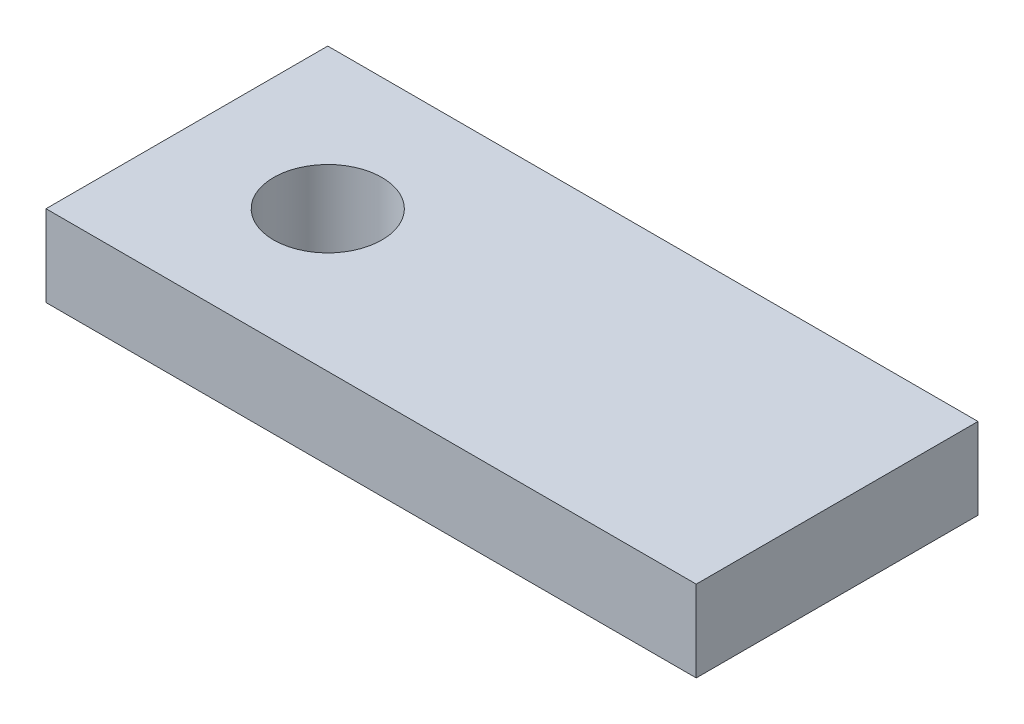
ISO-10303-21;
HEADER;
FILE_DESCRIPTION(('STEP AP214'),'2;1');
FILE_NAME('part.step','',(''),(''),'','','');
FILE_SCHEMA(('AUTOMOTIVE_DESIGN { 1 0 10303 214 1 1 1 1 }'));
ENDSEC;
DATA;
#1=APPLICATION_CONTEXT('core data for automotive mechanical design processes');
#2=APPLICATION_PROTOCOL_DEFINITION('international standard','automotive_design',2000,#1);
#3=PRODUCT_CONTEXT('',#1,'mechanical');
#4=PRODUCT('Part','Part','',(#3));
#5=PRODUCT_RELATED_PRODUCT_CATEGORY('part','',(#4));
#6=PRODUCT_DEFINITION_FORMATION('','',#4);
#7=PRODUCT_DEFINITION_CONTEXT('part definition',#1,'design');
#8=PRODUCT_DEFINITION('design','',#6,#7);
#9=PRODUCT_DEFINITION_SHAPE('','',#8);
#10=(LENGTH_UNIT() NAMED_UNIT(*) SI_UNIT(.MILLI.,.METRE.));
#11=(NAMED_UNIT(*) PLANE_ANGLE_UNIT() SI_UNIT($,.RADIAN.));
#12=(NAMED_UNIT(*) SI_UNIT($,.STERADIAN.) SOLID_ANGLE_UNIT());
#13=UNCERTAINTY_MEASURE_WITH_UNIT(LENGTH_MEASURE(1.E-05),#10,'distance_accuracy_value','');
#14=(GEOMETRIC_REPRESENTATION_CONTEXT(3) GLOBAL_UNCERTAINTY_ASSIGNED_CONTEXT((#13)) GLOBAL_UNIT_ASSIGNED_CONTEXT((#10,
#11,#12)) REPRESENTATION_CONTEXT('',''));
#15=CARTESIAN_POINT('',(0.,0.,0.));
#16=DIRECTION('',(0.,0.,1.));
#17=DIRECTION('',(1.,0.,0.));
#18=AXIS2_PLACEMENT_3D('',#15,#16,#17);
#19=CARTESIAN_POINT('',(0.,1.5,0.));
#20=DIRECTION('',(0.,1.,0.));
#21=DIRECTION('',(0.,0.,1.));
#22=AXIS2_PLACEMENT_3D('',#19,#20,#21);
#23=PLANE('',#22);
#24=DIRECTION('',(0.,0.,1.));
#25=VECTOR('',#24,1.);
#26=CARTESIAN_POINT('',(-2.6,1.5,-2.6));
#27=LINE('',#26,#25);
#28=CARTESIAN_POINT('',(-2.6,1.5,-2.6));
#29=VERTEX_POINT('',#28);
#30=CARTESIAN_POINT('',(-2.6,1.5,2.6));
#31=VERTEX_POINT('',#30);
#32=EDGE_CURVE('E85',#29,#31,#27,.T.);
#33=ORIENTED_EDGE('',*,*,#32,.T.);
#34=DIRECTION('',(1.,0.,0.));
#35=VECTOR('',#34,1.);
#36=CARTESIAN_POINT('',(-2.6,1.5,2.6));
#37=LINE('',#36,#35);
#38=CARTESIAN_POINT('',(9.4,1.5,2.6));
#39=VERTEX_POINT('',#38);
#40=EDGE_CURVE('E80',#31,#39,#37,.T.);
#41=ORIENTED_EDGE('',*,*,#40,.T.);
#42=DIRECTION('',(0.,0.,-1.));
#43=VECTOR('',#42,1.);
#44=CARTESIAN_POINT('',(9.4,1.5,-2.6));
#45=LINE('',#44,#43);
#46=CARTESIAN_POINT('',(9.4,1.5,-2.6));
#47=VERTEX_POINT('',#46);
#48=EDGE_CURVE('E83',#39,#47,#45,.T.);
#49=ORIENTED_EDGE('',*,*,#48,.T.);
#50=DIRECTION('',(-1.,0.,0.));
#51=VECTOR('',#50,1.);
#52=CARTESIAN_POINT('',(-2.6,1.5,-2.6));
#53=LINE('',#52,#51);
#54=EDGE_CURVE('E50',#47,#29,#53,.T.);
#55=ORIENTED_EDGE('',*,*,#54,.T.);
#56=EDGE_LOOP('',(#33,#41,#49,#55));
#57=FACE_BOUND('',#56,.T.);
#58=CARTESIAN_POINT('',(0.,1.5,0.));
#59=DIRECTION('',(0.,1.,0.));
#60=DIRECTION('',(0.,0.,1.));
#61=AXIS2_PLACEMENT_3D('',#58,#59,#60);
#62=CIRCLE('',#61,1.);
#63=CARTESIAN_POINT('',(0.,1.5,1.));
#64=VERTEX_POINT('',#63);
#65=EDGE_CURVE('E100',#64,#64,#62,.T.);
#66=ORIENTED_EDGE('',*,*,#65,.F.);
#67=EDGE_LOOP('',(#66));
#68=FACE_BOUND('',#67,.T.);
#69=ADVANCED_FACE('F33',(#57,#68),#23,.T.);
#70=CARTESIAN_POINT('',(0.,0.,0.));
#71=DIRECTION('',(0.,1.,0.));
#72=DIRECTION('',(0.,0.,1.));
#73=AXIS2_PLACEMENT_3D('',#70,#71,#72);
#74=PLANE('',#73);
#75=DIRECTION('',(0.,0.,1.));
#76=VECTOR('',#75,1.);
#77=CARTESIAN_POINT('',(-2.6,0.,-2.6));
#78=LINE('',#77,#76);
#79=CARTESIAN_POINT('',(-2.6,0.,-2.6));
#80=VERTEX_POINT('',#79);
#81=CARTESIAN_POINT('',(-2.6,0.,2.6));
#82=VERTEX_POINT('',#81);
#83=EDGE_CURVE('E97',#80,#82,#78,.T.);
#84=ORIENTED_EDGE('',*,*,#83,.F.);
#85=DIRECTION('',(-1.,0.,0.));
#86=VECTOR('',#85,1.);
#87=CARTESIAN_POINT('',(-2.6,0.,-2.6));
#88=LINE('',#87,#86);
#89=CARTESIAN_POINT('',(9.4,0.,-2.6));
#90=VERTEX_POINT('',#89);
#91=EDGE_CURVE('E73',#90,#80,#88,.T.);
#92=ORIENTED_EDGE('',*,*,#91,.F.);
#93=DIRECTION('',(0.,0.,-1.));
#94=VECTOR('',#93,1.);
#95=CARTESIAN_POINT('',(9.4,0.,-2.6));
#96=LINE('',#95,#94);
#97=CARTESIAN_POINT('',(9.4,0.,2.6));
#98=VERTEX_POINT('',#97);
#99=EDGE_CURVE('E67',#98,#90,#96,.T.);
#100=ORIENTED_EDGE('',*,*,#99,.F.);
#101=DIRECTION('',(1.,0.,0.));
#102=VECTOR('',#101,1.);
#103=CARTESIAN_POINT('',(-2.6,0.,2.6));
#104=LINE('',#103,#102);
#105=EDGE_CURVE('E89',#82,#98,#104,.T.);
#106=ORIENTED_EDGE('',*,*,#105,.F.);
#107=EDGE_LOOP('',(#84,#92,#100,#106));
#108=FACE_BOUND('',#107,.T.);
#109=CARTESIAN_POINT('',(0.,0.,0.));
#110=DIRECTION('',(0.,1.,0.));
#111=DIRECTION('',(0.,0.,1.));
#112=AXIS2_PLACEMENT_3D('',#109,#110,#111);
#113=CIRCLE('',#112,1.);
#114=CARTESIAN_POINT('',(0.,0.,1.));
#115=VERTEX_POINT('',#114);
#116=EDGE_CURVE('E112',#115,#115,#113,.T.);
#117=ORIENTED_EDGE('',*,*,#116,.T.);
#118=EDGE_LOOP('',(#117));
#119=FACE_BOUND('',#118,.T.);
#120=ADVANCED_FACE('F108',(#108,#119),#74,.F.);
#121=CARTESIAN_POINT('',(-2.6,1.5,-2.6));
#122=DIRECTION('',(1.,0.,0.));
#123=DIRECTION('',(0.,0.,-1.));
#124=AXIS2_PLACEMENT_3D('',#121,#122,#123);
#125=PLANE('',#124);
#126=ORIENTED_EDGE('',*,*,#83,.T.);
#127=DIRECTION('',(0.,-1.,0.));
#128=VECTOR('',#127,1.);
#129=CARTESIAN_POINT('',(-2.6,1.5,2.6));
#130=LINE('',#129,#128);
#131=EDGE_CURVE('E11',#31,#82,#130,.T.);
#132=ORIENTED_EDGE('',*,*,#131,.F.);
#133=ORIENTED_EDGE('',*,*,#32,.F.);
#134=DIRECTION('',(0.,-1.,0.));
#135=VECTOR('',#134,1.);
#136=CARTESIAN_POINT('',(-2.6,1.5,-2.6));
#137=LINE('',#136,#135);
#138=EDGE_CURVE('E93',#29,#80,#137,.T.);
#139=ORIENTED_EDGE('',*,*,#138,.T.);
#140=EDGE_LOOP('',(#126,#132,#133,#139));
#141=FACE_BOUND('',#140,.T.);
#142=ADVANCED_FACE('F35',(#141),#125,.F.);
#143=CARTESIAN_POINT('',(-2.6,1.5,2.6));
#144=DIRECTION('',(0.,0.,-1.));
#145=DIRECTION('',(-1.,0.,0.));
#146=AXIS2_PLACEMENT_3D('',#143,#144,#145);
#147=PLANE('',#146);
#148=ORIENTED_EDGE('',*,*,#105,.T.);
#149=DIRECTION('',(0.,-1.,0.));
#150=VECTOR('',#149,1.);
#151=CARTESIAN_POINT('',(9.4,1.5,2.6));
#152=LINE('',#151,#150);
#153=EDGE_CURVE('E42',#39,#98,#152,.T.);
#154=ORIENTED_EDGE('',*,*,#153,.F.);
#155=ORIENTED_EDGE('',*,*,#40,.F.);
#156=ORIENTED_EDGE('',*,*,#131,.T.);
#157=EDGE_LOOP('',(#148,#154,#155,#156));
#158=FACE_BOUND('',#157,.T.);
#159=ADVANCED_FACE('F88',(#158),#147,.F.);
#160=CARTESIAN_POINT('',(9.4,1.5,-2.6));
#161=DIRECTION('',(-1.,0.,0.));
#162=DIRECTION('',(0.,0.,1.));
#163=AXIS2_PLACEMENT_3D('',#160,#161,#162);
#164=PLANE('',#163);
#165=ORIENTED_EDGE('',*,*,#99,.T.);
#166=DIRECTION('',(0.,-1.,0.));
#167=VECTOR('',#166,1.);
#168=CARTESIAN_POINT('',(9.4,1.5,-2.6));
#169=LINE('',#168,#167);
#170=EDGE_CURVE('E90',#47,#90,#169,.T.);
#171=ORIENTED_EDGE('',*,*,#170,.F.);
#172=ORIENTED_EDGE('',*,*,#48,.F.);
#173=ORIENTED_EDGE('',*,*,#153,.T.);
#174=EDGE_LOOP('',(#165,#171,#172,#173));
#175=FACE_BOUND('',#174,.T.);
#176=ADVANCED_FACE('F91',(#175),#164,.F.);
#177=CARTESIAN_POINT('',(-2.6,1.5,-2.6));
#178=DIRECTION('',(0.,0.,1.));
#179=DIRECTION('',(1.,0.,0.));
#180=AXIS2_PLACEMENT_3D('',#177,#178,#179);
#181=PLANE('',#180);
#182=ORIENTED_EDGE('',*,*,#91,.T.);
#183=ORIENTED_EDGE('',*,*,#138,.F.);
#184=ORIENTED_EDGE('',*,*,#54,.F.);
#185=ORIENTED_EDGE('',*,*,#170,.T.);
#186=EDGE_LOOP('',(#182,#183,#184,#185));
#187=FACE_BOUND('',#186,.T.);
#188=ADVANCED_FACE('F105',(#187),#181,.F.);
#189=CARTESIAN_POINT('',(0.,1.5,0.));
#190=DIRECTION('',(0.,-1.,0.));
#191=DIRECTION('',(0.,0.,-1.));
#192=AXIS2_PLACEMENT_3D('',#189,#190,#191);
#193=CYLINDRICAL_SURFACE('',#192,1.);
#194=ORIENTED_EDGE('',*,*,#65,.T.);
#195=EDGE_LOOP('',(#194));
#196=FACE_BOUND('',#195,.T.);
#197=ORIENTED_EDGE('',*,*,#116,.F.);
#198=EDGE_LOOP('',(#197));
#199=FACE_BOUND('',#198,.T.);
#200=ADVANCED_FACE('F118',(#196,#199),#193,.F.);
#201=CLOSED_SHELL('',(#69,#120,#142,#159,#176,#188,#200));
#202=MANIFOLD_SOLID_BREP('B2',#201);
#203=ADVANCED_BREP_SHAPE_REPRESENTATION('',(#18,#202),#14);
#204=SHAPE_DEFINITION_REPRESENTATION(#9,#203);
ENDSEC;
END-ISO-10303-21;
